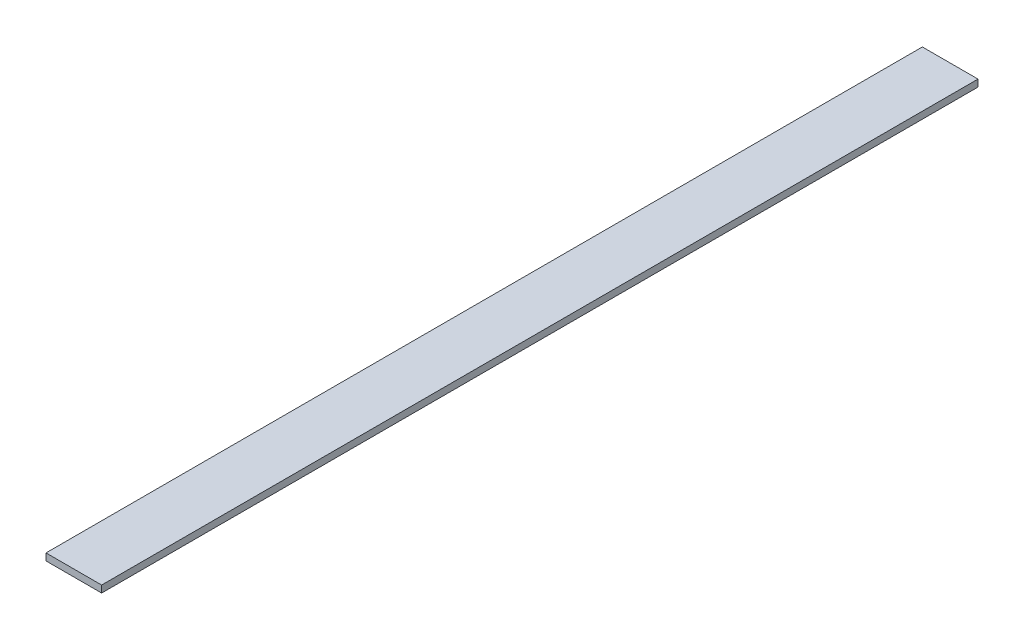
ISO-10303-21;
HEADER;
FILE_DESCRIPTION(('STEP AP214'),'2;1');
FILE_NAME('part.step','',(''),(''),'','','');
FILE_SCHEMA(('AUTOMOTIVE_DESIGN { 1 0 10303 214 1 1 1 1 }'));
ENDSEC;
DATA;
#1=APPLICATION_CONTEXT('core data for automotive mechanical design processes');
#2=APPLICATION_PROTOCOL_DEFINITION('international standard','automotive_design',2000,#1);
#3=PRODUCT_CONTEXT('',#1,'mechanical');
#4=PRODUCT('Part','Part','',(#3));
#5=PRODUCT_RELATED_PRODUCT_CATEGORY('part','',(#4));
#6=PRODUCT_DEFINITION_FORMATION('','',#4);
#7=PRODUCT_DEFINITION_CONTEXT('part definition',#1,'design');
#8=PRODUCT_DEFINITION('design','',#6,#7);
#9=PRODUCT_DEFINITION_SHAPE('','',#8);
#10=(LENGTH_UNIT() NAMED_UNIT(*) SI_UNIT(.MILLI.,.METRE.));
#11=(NAMED_UNIT(*) PLANE_ANGLE_UNIT() SI_UNIT($,.RADIAN.));
#12=(NAMED_UNIT(*) SI_UNIT($,.STERADIAN.) SOLID_ANGLE_UNIT());
#13=UNCERTAINTY_MEASURE_WITH_UNIT(LENGTH_MEASURE(1.E-05),#10,'distance_accuracy_value','');
#14=(GEOMETRIC_REPRESENTATION_CONTEXT(3) GLOBAL_UNCERTAINTY_ASSIGNED_CONTEXT((#13)) GLOBAL_UNIT_ASSIGNED_CONTEXT((#10,
#11,#12)) REPRESENTATION_CONTEXT('',''));
#15=CARTESIAN_POINT('',(0.,0.,0.));
#16=DIRECTION('',(0.,0.,1.));
#17=DIRECTION('',(1.,0.,0.));
#18=AXIS2_PLACEMENT_3D('',#15,#16,#17);
#19=CARTESIAN_POINT('',(-7.15608808290155,3.27370466321244,-800.));
#20=DIRECTION('',(-1.,0.,0.));
#21=DIRECTION('',(0.,0.,1.));
#22=AXIS2_PLACEMENT_3D('',#19,#20,#21);
#23=PLANE('',#22);
#24=DIRECTION('',(0.,-1.,0.));
#25=VECTOR('',#24,1.);
#26=CARTESIAN_POINT('',(-7.15608808290155,3.27370466321244,0.));
#27=LINE('',#26,#25);
#28=CARTESIAN_POINT('',(-7.15608808290155,3.27370466321244,0.));
#29=VERTEX_POINT('',#28);
#30=CARTESIAN_POINT('',(-7.15608808290155,-3.07629533678756,0.));
#31=VERTEX_POINT('',#30);
#32=EDGE_CURVE('E97',#29,#31,#27,.T.);
#33=ORIENTED_EDGE('',*,*,#32,.F.);
#34=DIRECTION('',(0.,0.,1.));
#35=VECTOR('',#34,1.);
#36=CARTESIAN_POINT('',(-7.15608808290155,3.27370466321244,-800.));
#37=LINE('',#36,#35);
#38=CARTESIAN_POINT('',(-7.15608808290155,3.27370466321244,-800.));
#39=VERTEX_POINT('',#38);
#40=EDGE_CURVE('E11',#39,#29,#37,.T.);
#41=ORIENTED_EDGE('',*,*,#40,.F.);
#42=DIRECTION('',(0.,-1.,0.));
#43=VECTOR('',#42,1.);
#44=CARTESIAN_POINT('',(-7.15608808290155,3.27370466321244,-800.));
#45=LINE('',#44,#43);
#46=CARTESIAN_POINT('',(-7.15608808290155,-3.07629533678756,-800.));
#47=VERTEX_POINT('',#46);
#48=EDGE_CURVE('E91',#39,#47,#45,.T.);
#49=ORIENTED_EDGE('',*,*,#48,.T.);
#50=DIRECTION('',(0.,0.,1.));
#51=VECTOR('',#50,1.);
#52=CARTESIAN_POINT('',(-7.15608808290155,-3.07629533678756,-800.));
#53=LINE('',#52,#51);
#54=EDGE_CURVE('E36',#47,#31,#53,.T.);
#55=ORIENTED_EDGE('',*,*,#54,.T.);
#56=EDGE_LOOP('',(#33,#41,#49,#55));
#57=FACE_BOUND('',#56,.T.);
#58=ADVANCED_FACE('F33',(#57),#23,.T.);
#59=CARTESIAN_POINT('',(-7.15608808290155,3.27370466321244,-800.));
#60=DIRECTION('',(0.,1.,0.));
#61=DIRECTION('',(0.,0.,1.));
#62=AXIS2_PLACEMENT_3D('',#59,#60,#61);
#63=PLANE('',#62);
#64=DIRECTION('',(-1.,0.,0.));
#65=VECTOR('',#64,1.);
#66=CARTESIAN_POINT('',(-7.15608808290155,3.27370466321244,0.));
#67=LINE('',#66,#65);
#68=CARTESIAN_POINT('',(43.6439119170984,3.27370466321244,0.));
#69=VERTEX_POINT('',#68);
#70=EDGE_CURVE('E93',#69,#29,#67,.T.);
#71=ORIENTED_EDGE('',*,*,#70,.F.);
#72=DIRECTION('',(0.,0.,1.));
#73=VECTOR('',#72,1.);
#74=CARTESIAN_POINT('',(43.6439119170984,3.27370466321244,-800.));
#75=LINE('',#74,#73);
#76=CARTESIAN_POINT('',(43.6439119170984,3.27370466321244,-800.));
#77=VERTEX_POINT('',#76);
#78=EDGE_CURVE('E42',#77,#69,#75,.T.);
#79=ORIENTED_EDGE('',*,*,#78,.F.);
#80=DIRECTION('',(-1.,0.,0.));
#81=VECTOR('',#80,1.);
#82=CARTESIAN_POINT('',(-7.15608808290155,3.27370466321244,-800.));
#83=LINE('',#82,#81);
#84=EDGE_CURVE('E88',#77,#39,#83,.T.);
#85=ORIENTED_EDGE('',*,*,#84,.T.);
#86=ORIENTED_EDGE('',*,*,#40,.T.);
#87=EDGE_LOOP('',(#71,#79,#85,#86));
#88=FACE_BOUND('',#87,.T.);
#89=ADVANCED_FACE('F107',(#88),#63,.T.);
#90=CARTESIAN_POINT('',(43.6439119170984,3.27370466321244,-800.));
#91=DIRECTION('',(1.,0.,0.));
#92=DIRECTION('',(0.,0.,-1.));
#93=AXIS2_PLACEMENT_3D('',#90,#91,#92);
#94=PLANE('',#93);
#95=DIRECTION('',(0.,1.,0.));
#96=VECTOR('',#95,1.);
#97=CARTESIAN_POINT('',(43.6439119170984,3.27370466321244,0.));
#98=LINE('',#97,#96);
#99=CARTESIAN_POINT('',(43.6439119170984,-3.07629533678756,0.));
#100=VERTEX_POINT('',#99);
#101=EDGE_CURVE('E83',#100,#69,#98,.T.);
#102=ORIENTED_EDGE('',*,*,#101,.F.);
#103=DIRECTION('',(0.,0.,1.));
#104=VECTOR('',#103,1.);
#105=CARTESIAN_POINT('',(43.6439119170984,-3.07629533678756,-800.));
#106=LINE('',#105,#104);
#107=CARTESIAN_POINT('',(43.6439119170984,-3.07629533678756,-800.));
#108=VERTEX_POINT('',#107);
#109=EDGE_CURVE('E78',#108,#100,#106,.T.);
#110=ORIENTED_EDGE('',*,*,#109,.F.);
#111=DIRECTION('',(0.,1.,0.));
#112=VECTOR('',#111,1.);
#113=CARTESIAN_POINT('',(43.6439119170984,3.27370466321244,-800.));
#114=LINE('',#113,#112);
#115=EDGE_CURVE('E81',#108,#77,#114,.T.);
#116=ORIENTED_EDGE('',*,*,#115,.T.);
#117=ORIENTED_EDGE('',*,*,#78,.T.);
#118=EDGE_LOOP('',(#102,#110,#116,#117));
#119=FACE_BOUND('',#118,.T.);
#120=ADVANCED_FACE('F80',(#119),#94,.T.);
#121=CARTESIAN_POINT('',(-7.15608808290155,-3.07629533678756,-800.));
#122=DIRECTION('',(0.,-1.,0.));
#123=DIRECTION('',(0.,0.,-1.));
#124=AXIS2_PLACEMENT_3D('',#121,#122,#123);
#125=PLANE('',#124);
#126=DIRECTION('',(1.,0.,0.));
#127=VECTOR('',#126,1.);
#128=CARTESIAN_POINT('',(-7.15608808290155,-3.07629533678756,0.));
#129=LINE('',#128,#127);
#130=EDGE_CURVE('E100',#31,#100,#129,.T.);
#131=ORIENTED_EDGE('',*,*,#130,.F.);
#132=ORIENTED_EDGE('',*,*,#54,.F.);
#133=DIRECTION('',(1.,0.,0.));
#134=VECTOR('',#133,1.);
#135=CARTESIAN_POINT('',(-7.15608808290155,-3.07629533678756,-800.));
#136=LINE('',#135,#134);
#137=EDGE_CURVE('E87',#47,#108,#136,.T.);
#138=ORIENTED_EDGE('',*,*,#137,.T.);
#139=ORIENTED_EDGE('',*,*,#109,.T.);
#140=EDGE_LOOP('',(#131,#132,#138,#139));
#141=FACE_BOUND('',#140,.T.);
#142=ADVANCED_FACE('F90',(#141),#125,.T.);
#143=CARTESIAN_POINT('',(0.,0.,-800.));
#144=DIRECTION('',(0.,0.,1.));
#145=DIRECTION('',(1.,0.,0.));
#146=AXIS2_PLACEMENT_3D('',#143,#144,#145);
#147=PLANE('',#146);
#148=ORIENTED_EDGE('',*,*,#48,.F.);
#149=ORIENTED_EDGE('',*,*,#84,.F.);
#150=ORIENTED_EDGE('',*,*,#115,.F.);
#151=ORIENTED_EDGE('',*,*,#137,.F.);
#152=EDGE_LOOP('',(#148,#149,#150,#151));
#153=FACE_BOUND('',#152,.T.);
#154=ADVANCED_FACE('F86',(#153),#147,.F.);
#155=CARTESIAN_POINT('',(0.,0.,0.));
#156=DIRECTION('',(0.,0.,1.));
#157=DIRECTION('',(1.,0.,0.));
#158=AXIS2_PLACEMENT_3D('',#155,#156,#157);
#159=PLANE('',#158);
#160=ORIENTED_EDGE('',*,*,#32,.T.);
#161=ORIENTED_EDGE('',*,*,#130,.T.);
#162=ORIENTED_EDGE('',*,*,#101,.T.);
#163=ORIENTED_EDGE('',*,*,#70,.T.);
#164=EDGE_LOOP('',(#160,#161,#162,#163));
#165=FACE_BOUND('',#164,.T.);
#166=ADVANCED_FACE('F106',(#165),#159,.T.);
#167=CLOSED_SHELL('',(#58,#89,#120,#142,#154,#166));
#168=MANIFOLD_SOLID_BREP('B2',#167);
#169=ADVANCED_BREP_SHAPE_REPRESENTATION('',(#18,#168),#14);
#170=SHAPE_DEFINITION_REPRESENTATION(#9,#169);
ENDSEC;
END-ISO-10303-21;
